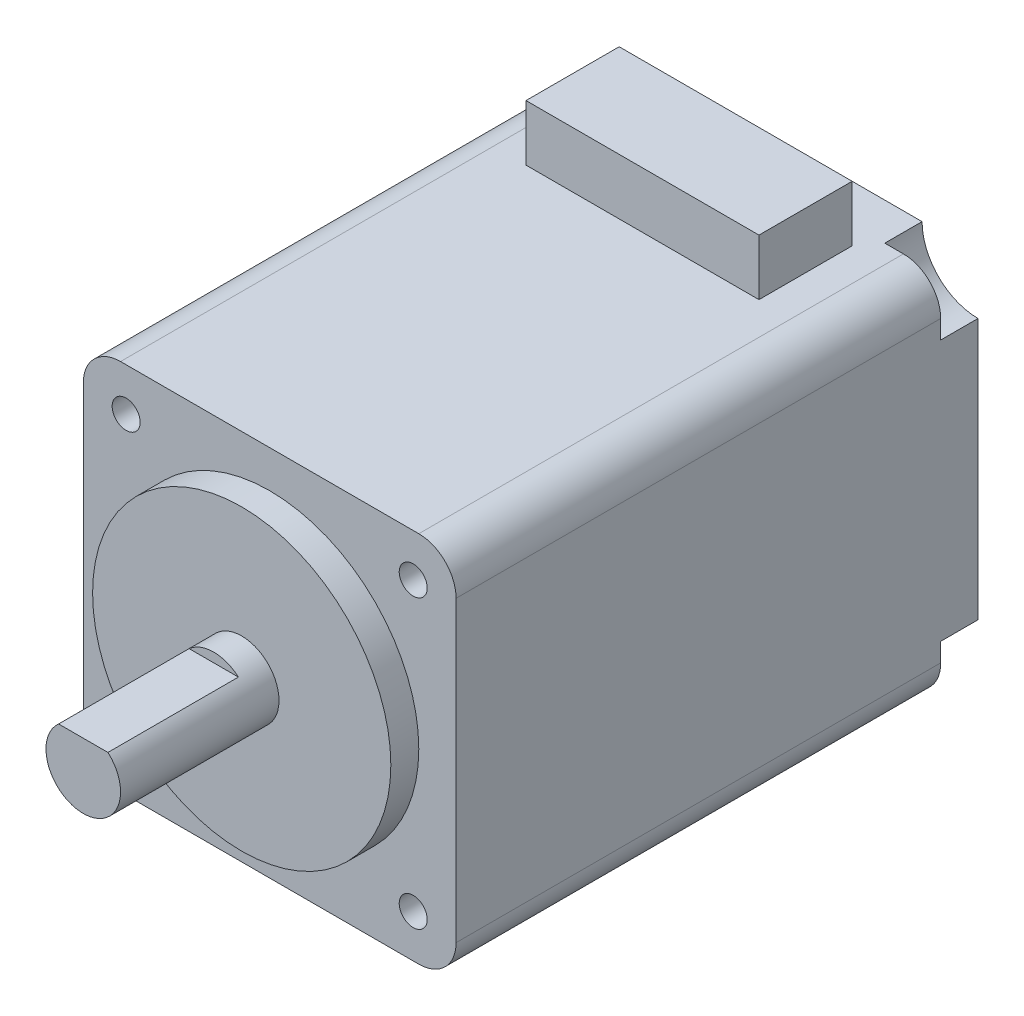
ISO-10303-21;
HEADER;
FILE_DESCRIPTION(('STEP AP214'),'2;1');
FILE_NAME('part.step','',(''),(''),'','','');
FILE_SCHEMA(('AUTOMOTIVE_DESIGN { 1 0 10303 214 1 1 1 1 }'));
ENDSEC;
DATA;
#1=APPLICATION_CONTEXT('core data for automotive mechanical design processes');
#2=APPLICATION_PROTOCOL_DEFINITION('international standard','automotive_design',2000,#1);
#3=PRODUCT_CONTEXT('',#1,'mechanical');
#4=PRODUCT('Part','Part','',(#3));
#5=PRODUCT_RELATED_PRODUCT_CATEGORY('part','',(#4));
#6=PRODUCT_DEFINITION_FORMATION('','',#4);
#7=PRODUCT_DEFINITION_CONTEXT('part definition',#1,'design');
#8=PRODUCT_DEFINITION('design','',#6,#7);
#9=PRODUCT_DEFINITION_SHAPE('','',#8);
#10=(LENGTH_UNIT() NAMED_UNIT(*) SI_UNIT(.MILLI.,.METRE.));
#11=(NAMED_UNIT(*) PLANE_ANGLE_UNIT() SI_UNIT($,.RADIAN.));
#12=(NAMED_UNIT(*) SI_UNIT($,.STERADIAN.) SOLID_ANGLE_UNIT());
#13=UNCERTAINTY_MEASURE_WITH_UNIT(LENGTH_MEASURE(1.E-05),#10,'distance_accuracy_value','');
#14=(GEOMETRIC_REPRESENTATION_CONTEXT(3) GLOBAL_UNCERTAINTY_ASSIGNED_CONTEXT((#13)) GLOBAL_UNIT_ASSIGNED_CONTEXT((#10,
#11,#12)) REPRESENTATION_CONTEXT('',''));
#15=CARTESIAN_POINT('',(0.,0.,0.));
#16=DIRECTION('',(0.,0.,1.));
#17=DIRECTION('',(1.,0.,0.));
#18=AXIS2_PLACEMENT_3D('',#15,#16,#17);
#19=CARTESIAN_POINT('',(-10.,10.,28.));
#20=DIRECTION('',(0.,-1.,0.));
#21=DIRECTION('',(0.,0.,-1.));
#22=AXIS2_PLACEMENT_3D('',#19,#20,#21);
#23=PLANE('',#22);
#24=DIRECTION('',(1.,0.,0.));
#25=VECTOR('',#24,1.);
#26=CARTESIAN_POINT('',(-10.,10.,2.));
#27=LINE('',#26,#25);
#28=CARTESIAN_POINT('',(-8.,10.,2.));
#29=VERTEX_POINT('',#28);
#30=CARTESIAN_POINT('',(-7.,10.,2.));
#31=VERTEX_POINT('',#30);
#32=EDGE_CURVE('E298',#29,#31,#27,.T.);
#33=ORIENTED_EDGE('',*,*,#32,.F.);
#34=DIRECTION('',(0.,0.,-1.));
#35=VECTOR('',#34,1.);
#36=CARTESIAN_POINT('',(-8.,10.,28.));
#37=LINE('',#36,#35);
#38=CARTESIAN_POINT('',(-8.,10.,28.));
#39=VERTEX_POINT('',#38);
#40=EDGE_CURVE('E371',#29,#39,#37,.F.);
#41=ORIENTED_EDGE('',*,*,#40,.T.);
#42=DIRECTION('',(-1.,0.,0.));
#43=VECTOR('',#42,1.);
#44=CARTESIAN_POINT('',(-10.,10.,28.));
#45=LINE('',#44,#43);
#46=CARTESIAN_POINT('',(8.,10.,28.));
#47=VERTEX_POINT('',#46);
#48=EDGE_CURVE('E306',#47,#39,#45,.T.);
#49=ORIENTED_EDGE('',*,*,#48,.F.);
#50=DIRECTION('',(0.,0.,-1.));
#51=VECTOR('',#50,1.);
#52=CARTESIAN_POINT('',(8.,10.,28.));
#53=LINE('',#52,#51);
#54=CARTESIAN_POINT('',(8.,10.,2.));
#55=VERTEX_POINT('',#54);
#56=EDGE_CURVE('E369',#47,#55,#53,.T.);
#57=ORIENTED_EDGE('',*,*,#56,.T.);
#58=DIRECTION('',(1.,0.,0.));
#59=VECTOR('',#58,1.);
#60=CARTESIAN_POINT('',(-10.,10.,2.));
#61=LINE('',#60,#59);
#62=CARTESIAN_POINT('',(7.,10.,2.));
#63=VERTEX_POINT('',#62);
#64=EDGE_CURVE('E337',#63,#55,#61,.T.);
#65=ORIENTED_EDGE('',*,*,#64,.F.);
#66=DIRECTION('',(0.,0.,-1.));
#67=VECTOR('',#66,1.);
#68=CARTESIAN_POINT('',(7.,10.,2.));
#69=LINE('',#68,#67);
#70=CARTESIAN_POINT('',(7.,10.,0.));
#71=VERTEX_POINT('',#70);
#72=EDGE_CURVE('E269',#63,#71,#69,.T.);
#73=ORIENTED_EDGE('',*,*,#72,.T.);
#74=DIRECTION('',(-1.,0.,0.));
#75=VECTOR('',#74,1.);
#76=CARTESIAN_POINT('',(-10.,10.,0.));
#77=LINE('',#76,#75);
#78=CARTESIAN_POINT('',(-7.,10.,0.));
#79=VERTEX_POINT('',#78);
#80=EDGE_CURVE('E319',#71,#79,#77,.T.);
#81=ORIENTED_EDGE('',*,*,#80,.T.);
#82=DIRECTION('',(0.,0.,-1.));
#83=VECTOR('',#82,1.);
#84=CARTESIAN_POINT('',(-7.,10.,2.));
#85=LINE('',#84,#83);
#86=EDGE_CURVE('E278',#79,#31,#85,.F.);
#87=ORIENTED_EDGE('',*,*,#86,.T.);
#88=EDGE_LOOP('',(#33,#41,#49,#57,#65,#73,#81,#87));
#89=FACE_BOUND('',#88,.T.);
#90=DIRECTION('',(0.,0.,-1.));
#91=VECTOR('',#90,1.);
#92=CARTESIAN_POINT('',(6.25,10.,8.));
#93=LINE('',#92,#91);
#94=CARTESIAN_POINT('',(6.25,10.,8.));
#95=VERTEX_POINT('',#94);
#96=CARTESIAN_POINT('',(6.25,10.,3.));
#97=VERTEX_POINT('',#96);
#98=EDGE_CURVE('E204',#95,#97,#93,.T.);
#99=ORIENTED_EDGE('',*,*,#98,.F.);
#100=DIRECTION('',(1.,0.,0.));
#101=VECTOR('',#100,1.);
#102=CARTESIAN_POINT('',(6.25,10.,8.));
#103=LINE('',#102,#101);
#104=CARTESIAN_POINT('',(-6.25,10.,8.00000000000001));
#105=VERTEX_POINT('',#104);
#106=EDGE_CURVE('E217',#105,#95,#103,.T.);
#107=ORIENTED_EDGE('',*,*,#106,.F.);
#108=DIRECTION('',(0.,0.,1.));
#109=VECTOR('',#108,1.);
#110=CARTESIAN_POINT('',(-6.25,10.,8.));
#111=LINE('',#110,#109);
#112=CARTESIAN_POINT('',(-6.25,10.,3.00000000000001));
#113=VERTEX_POINT('',#112);
#114=EDGE_CURVE('E229',#113,#105,#111,.T.);
#115=ORIENTED_EDGE('',*,*,#114,.F.);
#116=DIRECTION('',(-1.,0.,0.));
#117=VECTOR('',#116,1.);
#118=CARTESIAN_POINT('',(6.25,10.,3.));
#119=LINE('',#118,#117);
#120=EDGE_CURVE('E226',#97,#113,#119,.T.);
#121=ORIENTED_EDGE('',*,*,#120,.F.);
#122=EDGE_LOOP('',(#99,#107,#115,#121));
#123=FACE_BOUND('',#122,.T.);
#124=ADVANCED_FACE('F38',(#89,#123),#23,.F.);
#125=CARTESIAN_POINT('',(10.,10.,28.));
#126=DIRECTION('',(-1.,0.,0.));
#127=DIRECTION('',(0.,-1.,0.));
#128=AXIS2_PLACEMENT_3D('',#125,#126,#127);
#129=PLANE('',#128);
#130=DIRECTION('',(0.,1.,0.));
#131=VECTOR('',#130,1.);
#132=CARTESIAN_POINT('',(10.,10.,28.));
#133=LINE('',#132,#131);
#134=CARTESIAN_POINT('',(10.,-8.,28.));
#135=VERTEX_POINT('',#134);
#136=CARTESIAN_POINT('',(10.,8.,28.));
#137=VERTEX_POINT('',#136);
#138=EDGE_CURVE('E303',#135,#137,#133,.T.);
#139=ORIENTED_EDGE('',*,*,#138,.F.);
#140=DIRECTION('',(0.,0.,-1.));
#141=VECTOR('',#140,1.);
#142=CARTESIAN_POINT('',(10.,-8.,28.));
#143=LINE('',#142,#141);
#144=CARTESIAN_POINT('',(10.,-8.,2.));
#145=VERTEX_POINT('',#144);
#146=EDGE_CURVE('E342',#135,#145,#143,.T.);
#147=ORIENTED_EDGE('',*,*,#146,.T.);
#148=DIRECTION('',(0.,-1.,0.));
#149=VECTOR('',#148,1.);
#150=CARTESIAN_POINT('',(10.,10.,2.));
#151=LINE('',#150,#149);
#152=CARTESIAN_POINT('',(10.,-7.,2.));
#153=VERTEX_POINT('',#152);
#154=EDGE_CURVE('E295',#153,#145,#151,.T.);
#155=ORIENTED_EDGE('',*,*,#154,.F.);
#156=DIRECTION('',(0.,0.,-1.));
#157=VECTOR('',#156,1.);
#158=CARTESIAN_POINT('',(10.,-7.,2.));
#159=LINE('',#158,#157);
#160=CARTESIAN_POINT('',(10.,-7.,0.));
#161=VERTEX_POINT('',#160);
#162=EDGE_CURVE('E290',#153,#161,#159,.T.);
#163=ORIENTED_EDGE('',*,*,#162,.T.);
#164=DIRECTION('',(0.,1.,0.));
#165=VECTOR('',#164,1.);
#166=CARTESIAN_POINT('',(10.,10.,0.));
#167=LINE('',#166,#165);
#168=CARTESIAN_POINT('',(10.,7.,0.));
#169=VERTEX_POINT('',#168);
#170=EDGE_CURVE('E302',#161,#169,#167,.T.);
#171=ORIENTED_EDGE('',*,*,#170,.T.);
#172=DIRECTION('',(0.,0.,-1.));
#173=VECTOR('',#172,1.);
#174=CARTESIAN_POINT('',(10.,7.,2.));
#175=LINE('',#174,#173);
#176=CARTESIAN_POINT('',(10.,7.,2.));
#177=VERTEX_POINT('',#176);
#178=EDGE_CURVE('E272',#169,#177,#175,.F.);
#179=ORIENTED_EDGE('',*,*,#178,.T.);
#180=DIRECTION('',(0.,-1.,0.));
#181=VECTOR('',#180,1.);
#182=CARTESIAN_POINT('',(10.,10.,2.));
#183=LINE('',#182,#181);
#184=CARTESIAN_POINT('',(10.,8.,2.));
#185=VERTEX_POINT('',#184);
#186=EDGE_CURVE('E300',#185,#177,#183,.T.);
#187=ORIENTED_EDGE('',*,*,#186,.F.);
#188=DIRECTION('',(0.,0.,-1.));
#189=VECTOR('',#188,1.);
#190=CARTESIAN_POINT('',(10.,8.,28.));
#191=LINE('',#190,#189);
#192=EDGE_CURVE('E340',#185,#137,#191,.F.);
#193=ORIENTED_EDGE('',*,*,#192,.T.);
#194=EDGE_LOOP('',(#139,#147,#155,#163,#171,#179,#187,#193));
#195=FACE_BOUND('',#194,.T.);
#196=ADVANCED_FACE('F380',(#195),#129,.F.);
#197=CARTESIAN_POINT('',(-10.,10.,28.));
#198=DIRECTION('',(1.,0.,0.));
#199=DIRECTION('',(0.,1.,0.));
#200=AXIS2_PLACEMENT_3D('',#197,#198,#199);
#201=PLANE('',#200);
#202=DIRECTION('',(0.,1.,0.));
#203=VECTOR('',#202,1.);
#204=CARTESIAN_POINT('',(-10.,10.,2.));
#205=LINE('',#204,#203);
#206=CARTESIAN_POINT('',(-10.,-8.,2.));
#207=VERTEX_POINT('',#206);
#208=CARTESIAN_POINT('',(-10.,-7.,2.));
#209=VERTEX_POINT('',#208);
#210=EDGE_CURVE('E293',#207,#209,#205,.T.);
#211=ORIENTED_EDGE('',*,*,#210,.F.);
#212=DIRECTION('',(0.,0.,-1.));
#213=VECTOR('',#212,1.);
#214=CARTESIAN_POINT('',(-10.,-8.,28.));
#215=LINE('',#214,#213);
#216=CARTESIAN_POINT('',(-10.,-8.,28.));
#217=VERTEX_POINT('',#216);
#218=EDGE_CURVE('E365',#207,#217,#215,.F.);
#219=ORIENTED_EDGE('',*,*,#218,.T.);
#220=DIRECTION('',(0.,-1.,0.));
#221=VECTOR('',#220,1.);
#222=CARTESIAN_POINT('',(-10.,10.,28.));
#223=LINE('',#222,#221);
#224=CARTESIAN_POINT('',(-10.,8.,28.));
#225=VERTEX_POINT('',#224);
#226=EDGE_CURVE('E310',#225,#217,#223,.T.);
#227=ORIENTED_EDGE('',*,*,#226,.F.);
#228=DIRECTION('',(0.,0.,-1.));
#229=VECTOR('',#228,1.);
#230=CARTESIAN_POINT('',(-10.,8.,28.));
#231=LINE('',#230,#229);
#232=CARTESIAN_POINT('',(-10.,8.,2.));
#233=VERTEX_POINT('',#232);
#234=EDGE_CURVE('E362',#225,#233,#231,.T.);
#235=ORIENTED_EDGE('',*,*,#234,.T.);
#236=DIRECTION('',(0.,1.,0.));
#237=VECTOR('',#236,1.);
#238=CARTESIAN_POINT('',(-10.,10.,2.));
#239=LINE('',#238,#237);
#240=CARTESIAN_POINT('',(-10.,7.,2.));
#241=VERTEX_POINT('',#240);
#242=EDGE_CURVE('E334',#241,#233,#239,.T.);
#243=ORIENTED_EDGE('',*,*,#242,.F.);
#244=DIRECTION('',(0.,0.,-1.));
#245=VECTOR('',#244,1.);
#246=CARTESIAN_POINT('',(-10.,7.,2.));
#247=LINE('',#246,#245);
#248=CARTESIAN_POINT('',(-10.,7.,0.));
#249=VERTEX_POINT('',#248);
#250=EDGE_CURVE('E275',#241,#249,#247,.T.);
#251=ORIENTED_EDGE('',*,*,#250,.T.);
#252=DIRECTION('',(0.,-1.,0.));
#253=VECTOR('',#252,1.);
#254=CARTESIAN_POINT('',(-10.,10.,0.));
#255=LINE('',#254,#253);
#256=CARTESIAN_POINT('',(-10.,-7.,0.));
#257=VERTEX_POINT('',#256);
#258=EDGE_CURVE('E322',#249,#257,#255,.T.);
#259=ORIENTED_EDGE('',*,*,#258,.T.);
#260=DIRECTION('',(0.,0.,-1.));
#261=VECTOR('',#260,1.);
#262=CARTESIAN_POINT('',(-10.,-7.,2.));
#263=LINE('',#262,#261);
#264=EDGE_CURVE('E284',#257,#209,#263,.F.);
#265=ORIENTED_EDGE('',*,*,#264,.T.);
#266=EDGE_LOOP('',(#211,#219,#227,#235,#243,#251,#259,#265));
#267=FACE_BOUND('',#266,.T.);
#268=ADVANCED_FACE('F397',(#267),#201,.F.);
#269=CARTESIAN_POINT('',(-10.,-10.,28.));
#270=DIRECTION('',(0.,1.,0.));
#271=DIRECTION('',(0.,0.,1.));
#272=AXIS2_PLACEMENT_3D('',#269,#270,#271);
#273=PLANE('',#272);
#274=DIRECTION('',(-1.,0.,0.));
#275=VECTOR('',#274,1.);
#276=CARTESIAN_POINT('',(-10.,-10.,2.));
#277=LINE('',#276,#275);
#278=CARTESIAN_POINT('',(8.,-10.,2.));
#279=VERTEX_POINT('',#278);
#280=CARTESIAN_POINT('',(7.,-10.,2.));
#281=VERTEX_POINT('',#280);
#282=EDGE_CURVE('E332',#279,#281,#277,.T.);
#283=ORIENTED_EDGE('',*,*,#282,.F.);
#284=DIRECTION('',(0.,0.,-1.));
#285=VECTOR('',#284,1.);
#286=CARTESIAN_POINT('',(8.,-10.,28.));
#287=LINE('',#286,#285);
#288=CARTESIAN_POINT('',(8.,-10.,28.));
#289=VERTEX_POINT('',#288);
#290=EDGE_CURVE('E350',#279,#289,#287,.F.);
#291=ORIENTED_EDGE('',*,*,#290,.T.);
#292=DIRECTION('',(1.,0.,0.));
#293=VECTOR('',#292,1.);
#294=CARTESIAN_POINT('',(-10.,-10.,28.));
#295=LINE('',#294,#293);
#296=CARTESIAN_POINT('',(-8.,-10.,28.));
#297=VERTEX_POINT('',#296);
#298=EDGE_CURVE('E313',#297,#289,#295,.T.);
#299=ORIENTED_EDGE('',*,*,#298,.F.);
#300=DIRECTION('',(0.,0.,-1.));
#301=VECTOR('',#300,1.);
#302=CARTESIAN_POINT('',(-8.,-10.,28.));
#303=LINE('',#302,#301);
#304=CARTESIAN_POINT('',(-8.,-10.,2.));
#305=VERTEX_POINT('',#304);
#306=EDGE_CURVE('E347',#297,#305,#303,.T.);
#307=ORIENTED_EDGE('',*,*,#306,.T.);
#308=DIRECTION('',(-1.,0.,0.));
#309=VECTOR('',#308,1.);
#310=CARTESIAN_POINT('',(-10.,-10.,2.));
#311=LINE('',#310,#309);
#312=CARTESIAN_POINT('',(-7.,-10.,2.));
#313=VERTEX_POINT('',#312);
#314=EDGE_CURVE('E329',#313,#305,#311,.T.);
#315=ORIENTED_EDGE('',*,*,#314,.F.);
#316=DIRECTION('',(0.,0.,-1.));
#317=VECTOR('',#316,1.);
#318=CARTESIAN_POINT('',(-7.,-10.,2.));
#319=LINE('',#318,#317);
#320=CARTESIAN_POINT('',(-7.,-10.,0.));
#321=VERTEX_POINT('',#320);
#322=EDGE_CURVE('E281',#313,#321,#319,.T.);
#323=ORIENTED_EDGE('',*,*,#322,.T.);
#324=DIRECTION('',(1.,0.,0.));
#325=VECTOR('',#324,1.);
#326=CARTESIAN_POINT('',(-10.,-10.,0.));
#327=LINE('',#326,#325);
#328=CARTESIAN_POINT('',(7.,-10.,0.));
#329=VERTEX_POINT('',#328);
#330=EDGE_CURVE('E307',#321,#329,#327,.T.);
#331=ORIENTED_EDGE('',*,*,#330,.T.);
#332=DIRECTION('',(0.,0.,-1.));
#333=VECTOR('',#332,1.);
#334=CARTESIAN_POINT('',(7.,-10.,2.));
#335=LINE('',#334,#333);
#336=EDGE_CURVE('E287',#329,#281,#335,.F.);
#337=ORIENTED_EDGE('',*,*,#336,.T.);
#338=EDGE_LOOP('',(#283,#291,#299,#307,#315,#323,#331,#337));
#339=FACE_BOUND('',#338,.T.);
#340=ADVANCED_FACE('F407',(#339),#273,.F.);
#341=CARTESIAN_POINT('',(0.,0.,28.));
#342=DIRECTION('',(0.,0.,1.));
#343=DIRECTION('',(1.,0.,0.));
#344=AXIS2_PLACEMENT_3D('',#341,#342,#343);
#345=PLANE('',#344);
#346=CARTESIAN_POINT('',(-7.7,-7.7,28.));
#347=DIRECTION('',(0.,0.,1.));
#348=DIRECTION('',(1.,0.,0.));
#349=AXIS2_PLACEMENT_3D('',#346,#347,#348);
#350=CIRCLE('',#349,0.749999999999999);
#351=CARTESIAN_POINT('',(-6.95,-7.7,28.));
#352=VERTEX_POINT('',#351);
#353=EDGE_CURVE('E825',#352,#352,#350,.T.);
#354=ORIENTED_EDGE('',*,*,#353,.F.);
#355=EDGE_LOOP('',(#354));
#356=FACE_BOUND('',#355,.T.);
#357=CARTESIAN_POINT('',(7.7,-7.7,28.));
#358=DIRECTION('',(0.,0.,1.));
#359=DIRECTION('',(1.,0.,0.));
#360=AXIS2_PLACEMENT_3D('',#357,#358,#359);
#361=CIRCLE('',#360,0.75);
#362=CARTESIAN_POINT('',(8.45,-7.7,28.));
#363=VERTEX_POINT('',#362);
#364=EDGE_CURVE('E824',#363,#363,#361,.T.);
#365=ORIENTED_EDGE('',*,*,#364,.F.);
#366=EDGE_LOOP('',(#365));
#367=FACE_BOUND('',#366,.T.);
#368=CARTESIAN_POINT('',(7.7,7.7,28.));
#369=DIRECTION('',(0.,0.,1.));
#370=DIRECTION('',(1.,0.,0.));
#371=AXIS2_PLACEMENT_3D('',#368,#369,#370);
#372=CIRCLE('',#371,0.75);
#373=CARTESIAN_POINT('',(8.45,7.7,28.));
#374=VERTEX_POINT('',#373);
#375=EDGE_CURVE('E844',#374,#374,#372,.T.);
#376=ORIENTED_EDGE('',*,*,#375,.F.);
#377=EDGE_LOOP('',(#376));
#378=FACE_BOUND('',#377,.T.);
#379=CARTESIAN_POINT('',(-7.7,7.7,28.));
#380=DIRECTION('',(0.,0.,1.));
#381=DIRECTION('',(1.,0.,0.));
#382=AXIS2_PLACEMENT_3D('',#379,#380,#381);
#383=CIRCLE('',#382,0.75);
#384=CARTESIAN_POINT('',(-6.95,7.7,28.));
#385=VERTEX_POINT('',#384);
#386=EDGE_CURVE('E837',#385,#385,#383,.T.);
#387=ORIENTED_EDGE('',*,*,#386,.F.);
#388=EDGE_LOOP('',(#387));
#389=FACE_BOUND('',#388,.T.);
#390=CARTESIAN_POINT('',(0.,0.,28.));
#391=DIRECTION('',(0.,0.,1.));
#392=DIRECTION('',(1.,0.,0.));
#393=AXIS2_PLACEMENT_3D('',#390,#391,#392);
#394=CIRCLE('',#393,8.);
#395=CARTESIAN_POINT('',(8.,0.,28.));
#396=VERTEX_POINT('',#395);
#397=EDGE_CURVE('E209',#396,#396,#394,.T.);
#398=ORIENTED_EDGE('',*,*,#397,.F.);
#399=EDGE_LOOP('',(#398));
#400=FACE_BOUND('',#399,.T.);
#401=ORIENTED_EDGE('',*,*,#298,.T.);
#402=CARTESIAN_POINT('',(8.,-8.,28.));
#403=DIRECTION('',(0.,0.,1.));
#404=DIRECTION('',(1.,0.,0.));
#405=AXIS2_PLACEMENT_3D('',#402,#403,#404);
#406=CIRCLE('',#405,2.);
#407=EDGE_CURVE('E358',#289,#135,#406,.T.);
#408=ORIENTED_EDGE('',*,*,#407,.T.);
#409=ORIENTED_EDGE('',*,*,#138,.T.);
#410=CARTESIAN_POINT('',(8.,8.,28.));
#411=DIRECTION('',(0.,0.,1.));
#412=DIRECTION('',(1.,0.,0.));
#413=AXIS2_PLACEMENT_3D('',#410,#411,#412);
#414=CIRCLE('',#413,2.);
#415=EDGE_CURVE('E352',#137,#47,#414,.T.);
#416=ORIENTED_EDGE('',*,*,#415,.T.);
#417=ORIENTED_EDGE('',*,*,#48,.T.);
#418=CARTESIAN_POINT('',(-8.,8.,28.));
#419=DIRECTION('',(0.,0.,1.));
#420=DIRECTION('',(1.,0.,0.));
#421=AXIS2_PLACEMENT_3D('',#418,#419,#420);
#422=CIRCLE('',#421,2.);
#423=EDGE_CURVE('E354',#39,#225,#422,.T.);
#424=ORIENTED_EDGE('',*,*,#423,.T.);
#425=ORIENTED_EDGE('',*,*,#226,.T.);
#426=CARTESIAN_POINT('',(-8.,-8.,28.));
#427=DIRECTION('',(0.,0.,1.));
#428=DIRECTION('',(1.,0.,0.));
#429=AXIS2_PLACEMENT_3D('',#426,#427,#428);
#430=CIRCLE('',#429,2.);
#431=EDGE_CURVE('E356',#217,#297,#430,.T.);
#432=ORIENTED_EDGE('',*,*,#431,.T.);
#433=EDGE_LOOP('',(#401,#408,#409,#416,#417,#424,#425,#432));
#434=FACE_BOUND('',#433,.T.);
#435=ADVANCED_FACE('F384',(#356,#367,#378,#389,#400,#434),#345,.T.);
#436=CARTESIAN_POINT('',(0.,0.,0.));
#437=DIRECTION('',(0.,0.,1.));
#438=DIRECTION('',(1.,0.,0.));
#439=AXIS2_PLACEMENT_3D('',#436,#437,#438);
#440=PLANE('',#439);
#441=CARTESIAN_POINT('',(0.,0.,0.));
#442=DIRECTION('',(0.,0.,-1.));
#443=DIRECTION('',(-1.,0.,0.));
#444=AXIS2_PLACEMENT_3D('',#441,#442,#443);
#445=CIRCLE('',#444,3.25);
#446=CARTESIAN_POINT('',(-3.25,0.,0.));
#447=VERTEX_POINT('',#446);
#448=EDGE_CURVE('E246',#447,#447,#445,.T.);
#449=ORIENTED_EDGE('',*,*,#448,.F.);
#450=EDGE_LOOP('',(#449));
#451=FACE_BOUND('',#450,.T.);
#452=ORIENTED_EDGE('',*,*,#170,.F.);
#453=CARTESIAN_POINT('',(10.,-10.,0.));
#454=DIRECTION('',(0.,0.,-1.));
#455=DIRECTION('',(-1.,0.,0.));
#456=AXIS2_PLACEMENT_3D('',#453,#454,#455);
#457=CIRCLE('',#456,3.);
#458=EDGE_CURVE('E263',#329,#161,#457,.T.);
#459=ORIENTED_EDGE('',*,*,#458,.F.);
#460=ORIENTED_EDGE('',*,*,#330,.F.);
#461=CARTESIAN_POINT('',(-10.,-10.,0.));
#462=DIRECTION('',(0.,0.,-1.));
#463=DIRECTION('',(-1.,0.,0.));
#464=AXIS2_PLACEMENT_3D('',#461,#462,#463);
#465=CIRCLE('',#464,3.);
#466=EDGE_CURVE('E258',#257,#321,#465,.T.);
#467=ORIENTED_EDGE('',*,*,#466,.F.);
#468=ORIENTED_EDGE('',*,*,#258,.F.);
#469=CARTESIAN_POINT('',(-10.,10.,0.));
#470=DIRECTION('',(0.,0.,-1.));
#471=DIRECTION('',(-1.,0.,0.));
#472=AXIS2_PLACEMENT_3D('',#469,#470,#471);
#473=CIRCLE('',#472,3.);
#474=EDGE_CURVE('E253',#79,#249,#473,.T.);
#475=ORIENTED_EDGE('',*,*,#474,.F.);
#476=ORIENTED_EDGE('',*,*,#80,.F.);
#477=CARTESIAN_POINT('',(10.,10.,0.));
#478=DIRECTION('',(0.,0.,1.));
#479=DIRECTION('',(1.,0.,0.));
#480=AXIS2_PLACEMENT_3D('',#477,#478,#479);
#481=CIRCLE('',#480,3.);
#482=EDGE_CURVE('E316',#71,#169,#481,.T.);
#483=ORIENTED_EDGE('',*,*,#482,.T.);
#484=EDGE_LOOP('',(#452,#459,#460,#467,#468,#475,#476,#483));
#485=FACE_BOUND('',#484,.T.);
#486=ADVANCED_FACE('F424',(#451,#485),#440,.F.);
#487=CARTESIAN_POINT('',(10.,10.,2.));
#488=DIRECTION('',(0.,0.,-1.));
#489=DIRECTION('',(-1.,0.,0.));
#490=AXIS2_PLACEMENT_3D('',#487,#488,#489);
#491=PLANE('',#490);
#492=ORIENTED_EDGE('',*,*,#64,.T.);
#493=CARTESIAN_POINT('',(8.,8.,2.));
#494=DIRECTION('',(0.,0.,-1.));
#495=DIRECTION('',(-1.,0.,0.));
#496=AXIS2_PLACEMENT_3D('',#493,#494,#495);
#497=CIRCLE('',#496,2.);
#498=EDGE_CURVE('E61',#55,#185,#497,.T.);
#499=ORIENTED_EDGE('',*,*,#498,.T.);
#500=ORIENTED_EDGE('',*,*,#186,.T.);
#501=CARTESIAN_POINT('',(10.,10.,2.));
#502=DIRECTION('',(0.,0.,-1.));
#503=DIRECTION('',(-1.,0.,0.));
#504=AXIS2_PLACEMENT_3D('',#501,#502,#503);
#505=CIRCLE('',#504,3.);
#506=EDGE_CURVE('E249',#177,#63,#505,.T.);
#507=ORIENTED_EDGE('',*,*,#506,.T.);
#508=EDGE_LOOP('',(#492,#499,#500,#507));
#509=FACE_BOUND('',#508,.T.);
#510=ADVANCED_FACE('F375',(#509),#491,.T.);
#511=CARTESIAN_POINT('',(10.,10.,2.));
#512=DIRECTION('',(0.,0.,-1.));
#513=DIRECTION('',(-1.,0.,0.));
#514=AXIS2_PLACEMENT_3D('',#511,#512,#513);
#515=CYLINDRICAL_SURFACE('',#514,3.);
#516=ORIENTED_EDGE('',*,*,#482,.F.);
#517=ORIENTED_EDGE('',*,*,#72,.F.);
#518=ORIENTED_EDGE('',*,*,#506,.F.);
#519=ORIENTED_EDGE('',*,*,#178,.F.);
#520=EDGE_LOOP('',(#516,#517,#518,#519));
#521=FACE_BOUND('',#520,.T.);
#522=ADVANCED_FACE('F429',(#521),#515,.F.);
#523=CARTESIAN_POINT('',(0.,0.,2.));
#524=DIRECTION('',(0.,0.,-1.));
#525=DIRECTION('',(-1.,0.,0.));
#526=AXIS2_PLACEMENT_3D('',#523,#524,#525);
#527=CYLINDRICAL_SURFACE('',#526,3.25);
#528=CARTESIAN_POINT('',(0.,0.,2.));
#529=DIRECTION('',(0.,0.,-1.));
#530=DIRECTION('',(-1.,0.,0.));
#531=AXIS2_PLACEMENT_3D('',#528,#529,#530);
#532=CIRCLE('',#531,3.25);
#533=CARTESIAN_POINT('',(-3.25,0.,2.));
#534=VERTEX_POINT('',#533);
#535=EDGE_CURVE('E250',#534,#534,#532,.T.);
#536=ORIENTED_EDGE('',*,*,#535,.F.);
#537=EDGE_LOOP('',(#536));
#538=FACE_BOUND('',#537,.T.);
#539=ORIENTED_EDGE('',*,*,#448,.T.);
#540=EDGE_LOOP('',(#539));
#541=FACE_BOUND('',#540,.T.);
#542=ADVANCED_FACE('F444',(#538,#541),#527,.F.);
#543=CARTESIAN_POINT('',(0.,0.,2.));
#544=DIRECTION('',(0.,0.,-1.));
#545=DIRECTION('',(-1.,0.,0.));
#546=AXIS2_PLACEMENT_3D('',#543,#544,#545);
#547=PLANE('',#546);
#548=ORIENTED_EDGE('',*,*,#535,.T.);
#549=EDGE_LOOP('',(#548));
#550=FACE_BOUND('',#549,.T.);
#551=ADVANCED_FACE('F436',(#550),#547,.T.);
#552=CARTESIAN_POINT('',(-10.,10.,2.));
#553=DIRECTION('',(0.,0.,-1.));
#554=DIRECTION('',(-1.,0.,0.));
#555=AXIS2_PLACEMENT_3D('',#552,#553,#554);
#556=PLANE('',#555);
#557=ORIENTED_EDGE('',*,*,#242,.T.);
#558=CARTESIAN_POINT('',(-8.,8.,2.));
#559=DIRECTION('',(0.,0.,-1.));
#560=DIRECTION('',(-1.,0.,0.));
#561=AXIS2_PLACEMENT_3D('',#558,#559,#560);
#562=CIRCLE('',#561,2.);
#563=EDGE_CURVE('E367',#233,#29,#562,.T.);
#564=ORIENTED_EDGE('',*,*,#563,.T.);
#565=ORIENTED_EDGE('',*,*,#32,.T.);
#566=CARTESIAN_POINT('',(-10.,10.,2.));
#567=DIRECTION('',(0.,0.,-1.));
#568=DIRECTION('',(-1.,0.,0.));
#569=AXIS2_PLACEMENT_3D('',#566,#567,#568);
#570=CIRCLE('',#569,3.);
#571=EDGE_CURVE('E255',#31,#241,#570,.T.);
#572=ORIENTED_EDGE('',*,*,#571,.T.);
#573=EDGE_LOOP('',(#557,#564,#565,#572));
#574=FACE_BOUND('',#573,.T.);
#575=ADVANCED_FACE('F434',(#574),#556,.T.);
#576=CARTESIAN_POINT('',(-10.,10.,2.));
#577=DIRECTION('',(0.,0.,-1.));
#578=DIRECTION('',(-1.,0.,0.));
#579=AXIS2_PLACEMENT_3D('',#576,#577,#578);
#580=CYLINDRICAL_SURFACE('',#579,3.);
#581=ORIENTED_EDGE('',*,*,#474,.T.);
#582=ORIENTED_EDGE('',*,*,#250,.F.);
#583=ORIENTED_EDGE('',*,*,#571,.F.);
#584=ORIENTED_EDGE('',*,*,#86,.F.);
#585=EDGE_LOOP('',(#581,#582,#583,#584));
#586=FACE_BOUND('',#585,.T.);
#587=ADVANCED_FACE('F432',(#586),#580,.F.);
#588=CARTESIAN_POINT('',(-10.,-10.,2.));
#589=DIRECTION('',(0.,0.,-1.));
#590=DIRECTION('',(-1.,0.,0.));
#591=AXIS2_PLACEMENT_3D('',#588,#589,#590);
#592=PLANE('',#591);
#593=ORIENTED_EDGE('',*,*,#314,.T.);
#594=CARTESIAN_POINT('',(-8.,-8.,2.));
#595=DIRECTION('',(0.,0.,-1.));
#596=DIRECTION('',(-1.,0.,0.));
#597=AXIS2_PLACEMENT_3D('',#594,#595,#596);
#598=CIRCLE('',#597,2.);
#599=EDGE_CURVE('E360',#305,#207,#598,.T.);
#600=ORIENTED_EDGE('',*,*,#599,.T.);
#601=ORIENTED_EDGE('',*,*,#210,.T.);
#602=CARTESIAN_POINT('',(-10.,-10.,2.));
#603=DIRECTION('',(0.,0.,-1.));
#604=DIRECTION('',(-1.,0.,0.));
#605=AXIS2_PLACEMENT_3D('',#602,#603,#604);
#606=CIRCLE('',#605,3.);
#607=EDGE_CURVE('E260',#209,#313,#606,.T.);
#608=ORIENTED_EDGE('',*,*,#607,.T.);
#609=EDGE_LOOP('',(#593,#600,#601,#608));
#610=FACE_BOUND('',#609,.T.);
#611=ADVANCED_FACE('F442',(#610),#592,.T.);
#612=CARTESIAN_POINT('',(-10.,-10.,2.));
#613=DIRECTION('',(0.,0.,-1.));
#614=DIRECTION('',(-1.,0.,0.));
#615=AXIS2_PLACEMENT_3D('',#612,#613,#614);
#616=CYLINDRICAL_SURFACE('',#615,3.);
#617=ORIENTED_EDGE('',*,*,#466,.T.);
#618=ORIENTED_EDGE('',*,*,#322,.F.);
#619=ORIENTED_EDGE('',*,*,#607,.F.);
#620=ORIENTED_EDGE('',*,*,#264,.F.);
#621=EDGE_LOOP('',(#617,#618,#619,#620));
#622=FACE_BOUND('',#621,.T.);
#623=ADVANCED_FACE('F585',(#622),#616,.F.);
#624=CARTESIAN_POINT('',(10.,-10.,2.));
#625=DIRECTION('',(0.,0.,-1.));
#626=DIRECTION('',(-1.,0.,0.));
#627=AXIS2_PLACEMENT_3D('',#624,#625,#626);
#628=PLANE('',#627);
#629=ORIENTED_EDGE('',*,*,#154,.T.);
#630=CARTESIAN_POINT('',(8.,-8.,2.));
#631=DIRECTION('',(0.,0.,-1.));
#632=DIRECTION('',(-1.,0.,0.));
#633=AXIS2_PLACEMENT_3D('',#630,#631,#632);
#634=CIRCLE('',#633,2.);
#635=EDGE_CURVE('E345',#145,#279,#634,.T.);
#636=ORIENTED_EDGE('',*,*,#635,.T.);
#637=ORIENTED_EDGE('',*,*,#282,.T.);
#638=CARTESIAN_POINT('',(10.,-10.,2.));
#639=DIRECTION('',(0.,0.,-1.));
#640=DIRECTION('',(-1.,0.,0.));
#641=AXIS2_PLACEMENT_3D('',#638,#639,#640);
#642=CIRCLE('',#641,3.);
#643=EDGE_CURVE('E245',#281,#153,#642,.T.);
#644=ORIENTED_EDGE('',*,*,#643,.T.);
#645=EDGE_LOOP('',(#629,#636,#637,#644));
#646=FACE_BOUND('',#645,.T.);
#647=ADVANCED_FACE('F415',(#646),#628,.T.);
#648=CARTESIAN_POINT('',(10.,-10.,2.));
#649=DIRECTION('',(0.,0.,-1.));
#650=DIRECTION('',(-1.,0.,0.));
#651=AXIS2_PLACEMENT_3D('',#648,#649,#650);
#652=CYLINDRICAL_SURFACE('',#651,3.);
#653=ORIENTED_EDGE('',*,*,#643,.F.);
#654=ORIENTED_EDGE('',*,*,#336,.F.);
#655=ORIENTED_EDGE('',*,*,#458,.T.);
#656=ORIENTED_EDGE('',*,*,#162,.F.);
#657=EDGE_LOOP('',(#653,#654,#655,#656));
#658=FACE_BOUND('',#657,.T.);
#659=ADVANCED_FACE('F418',(#658),#652,.F.);
#660=CARTESIAN_POINT('',(6.25,13.,8.));
#661=DIRECTION('',(-1.,0.,0.));
#662=DIRECTION('',(0.,0.,1.));
#663=AXIS2_PLACEMENT_3D('',#660,#661,#662);
#664=PLANE('',#663);
#665=ORIENTED_EDGE('',*,*,#98,.T.);
#666=DIRECTION('',(0.,-1.,0.));
#667=VECTOR('',#666,1.);
#668=CARTESIAN_POINT('',(6.25,13.,3.));
#669=LINE('',#668,#667);
#670=CARTESIAN_POINT('',(6.25,13.,3.));
#671=VERTEX_POINT('',#670);
#672=EDGE_CURVE('E242',#671,#97,#669,.T.);
#673=ORIENTED_EDGE('',*,*,#672,.F.);
#674=DIRECTION('',(0.,0.,-1.));
#675=VECTOR('',#674,1.);
#676=CARTESIAN_POINT('',(6.25,13.,8.));
#677=LINE('',#676,#675);
#678=CARTESIAN_POINT('',(6.25,13.,8.));
#679=VERTEX_POINT('',#678);
#680=EDGE_CURVE('E213',#679,#671,#677,.T.);
#681=ORIENTED_EDGE('',*,*,#680,.F.);
#682=DIRECTION('',(0.,-1.,0.));
#683=VECTOR('',#682,1.);
#684=CARTESIAN_POINT('',(6.25,13.,8.));
#685=LINE('',#684,#683);
#686=EDGE_CURVE('E223',#679,#95,#685,.T.);
#687=ORIENTED_EDGE('',*,*,#686,.T.);
#688=EDGE_LOOP('',(#665,#673,#681,#687));
#689=FACE_BOUND('',#688,.T.);
#690=ADVANCED_FACE('F495',(#689),#664,.F.);
#691=CARTESIAN_POINT('',(6.25,13.,3.));
#692=DIRECTION('',(0.,0.,1.));
#693=DIRECTION('',(1.,0.,0.));
#694=AXIS2_PLACEMENT_3D('',#691,#692,#693);
#695=PLANE('',#694);
#696=ORIENTED_EDGE('',*,*,#120,.T.);
#697=DIRECTION('',(0.,-1.,0.));
#698=VECTOR('',#697,1.);
#699=CARTESIAN_POINT('',(-6.25,13.,3.));
#700=LINE('',#699,#698);
#701=CARTESIAN_POINT('',(-6.25,13.,3.));
#702=VERTEX_POINT('',#701);
#703=EDGE_CURVE('E239',#702,#113,#700,.T.);
#704=ORIENTED_EDGE('',*,*,#703,.F.);
#705=DIRECTION('',(-1.,0.,0.));
#706=VECTOR('',#705,1.);
#707=CARTESIAN_POINT('',(6.25,13.,3.));
#708=LINE('',#707,#706);
#709=EDGE_CURVE('E216',#671,#702,#708,.T.);
#710=ORIENTED_EDGE('',*,*,#709,.F.);
#711=ORIENTED_EDGE('',*,*,#672,.T.);
#712=EDGE_LOOP('',(#696,#704,#710,#711));
#713=FACE_BOUND('',#712,.T.);
#714=ADVANCED_FACE('F491',(#713),#695,.F.);
#715=CARTESIAN_POINT('',(-6.25,13.,8.));
#716=DIRECTION('',(1.,0.,0.));
#717=DIRECTION('',(0.,0.,-1.));
#718=AXIS2_PLACEMENT_3D('',#715,#716,#717);
#719=PLANE('',#718);
#720=ORIENTED_EDGE('',*,*,#114,.T.);
#721=DIRECTION('',(0.,-1.,0.));
#722=VECTOR('',#721,1.);
#723=CARTESIAN_POINT('',(-6.25,13.,8.));
#724=LINE('',#723,#722);
#725=CARTESIAN_POINT('',(-6.25,13.,8.));
#726=VERTEX_POINT('',#725);
#727=EDGE_CURVE('E236',#726,#105,#724,.T.);
#728=ORIENTED_EDGE('',*,*,#727,.F.);
#729=DIRECTION('',(0.,0.,1.));
#730=VECTOR('',#729,1.);
#731=CARTESIAN_POINT('',(-6.25,13.,8.));
#732=LINE('',#731,#730);
#733=EDGE_CURVE('E219',#702,#726,#732,.T.);
#734=ORIENTED_EDGE('',*,*,#733,.F.);
#735=ORIENTED_EDGE('',*,*,#703,.T.);
#736=EDGE_LOOP('',(#720,#728,#734,#735));
#737=FACE_BOUND('',#736,.T.);
#738=ADVANCED_FACE('F487',(#737),#719,.F.);
#739=CARTESIAN_POINT('',(6.25,13.,8.));
#740=DIRECTION('',(0.,0.,-1.));
#741=DIRECTION('',(-1.,0.,0.));
#742=AXIS2_PLACEMENT_3D('',#739,#740,#741);
#743=PLANE('',#742);
#744=ORIENTED_EDGE('',*,*,#106,.T.);
#745=ORIENTED_EDGE('',*,*,#686,.F.);
#746=DIRECTION('',(1.,0.,0.));
#747=VECTOR('',#746,1.);
#748=CARTESIAN_POINT('',(6.25,13.,8.));
#749=LINE('',#748,#747);
#750=EDGE_CURVE('E221',#726,#679,#749,.T.);
#751=ORIENTED_EDGE('',*,*,#750,.F.);
#752=ORIENTED_EDGE('',*,*,#727,.T.);
#753=EDGE_LOOP('',(#744,#745,#751,#752));
#754=FACE_BOUND('',#753,.T.);
#755=ADVANCED_FACE('F483',(#754),#743,.F.);
#756=CARTESIAN_POINT('',(0.,13.,0.));
#757=DIRECTION('',(0.,1.,0.));
#758=DIRECTION('',(0.,0.,1.));
#759=AXIS2_PLACEMENT_3D('',#756,#757,#758);
#760=PLANE('',#759);
#761=ORIENTED_EDGE('',*,*,#680,.T.);
#762=ORIENTED_EDGE('',*,*,#709,.T.);
#763=ORIENTED_EDGE('',*,*,#733,.T.);
#764=ORIENTED_EDGE('',*,*,#750,.T.);
#765=EDGE_LOOP('',(#761,#762,#763,#764));
#766=FACE_BOUND('',#765,.T.);
#767=ADVANCED_FACE('F459',(#766),#760,.T.);
#768=CARTESIAN_POINT('',(8.,-8.,28.));
#769=DIRECTION('',(0.,0.,-1.));
#770=DIRECTION('',(-1.,0.,0.));
#771=AXIS2_PLACEMENT_3D('',#768,#769,#770);
#772=CYLINDRICAL_SURFACE('',#771,2.);
#773=ORIENTED_EDGE('',*,*,#407,.F.);
#774=ORIENTED_EDGE('',*,*,#290,.F.);
#775=ORIENTED_EDGE('',*,*,#635,.F.);
#776=ORIENTED_EDGE('',*,*,#146,.F.);
#777=EDGE_LOOP('',(#773,#774,#775,#776));
#778=FACE_BOUND('',#777,.T.);
#779=ADVANCED_FACE('F411',(#778),#772,.T.);
#780=CARTESIAN_POINT('',(-8.,-8.,28.));
#781=DIRECTION('',(0.,0.,-1.));
#782=DIRECTION('',(-1.,0.,0.));
#783=AXIS2_PLACEMENT_3D('',#780,#781,#782);
#784=CYLINDRICAL_SURFACE('',#783,2.);
#785=ORIENTED_EDGE('',*,*,#431,.F.);
#786=ORIENTED_EDGE('',*,*,#218,.F.);
#787=ORIENTED_EDGE('',*,*,#599,.F.);
#788=ORIENTED_EDGE('',*,*,#306,.F.);
#789=EDGE_LOOP('',(#785,#786,#787,#788));
#790=FACE_BOUND('',#789,.T.);
#791=ADVANCED_FACE('F401',(#790),#784,.T.);
#792=CARTESIAN_POINT('',(-8.,8.,28.));
#793=DIRECTION('',(0.,0.,-1.));
#794=DIRECTION('',(-1.,0.,0.));
#795=AXIS2_PLACEMENT_3D('',#792,#793,#794);
#796=CYLINDRICAL_SURFACE('',#795,2.);
#797=ORIENTED_EDGE('',*,*,#423,.F.);
#798=ORIENTED_EDGE('',*,*,#40,.F.);
#799=ORIENTED_EDGE('',*,*,#563,.F.);
#800=ORIENTED_EDGE('',*,*,#234,.F.);
#801=EDGE_LOOP('',(#797,#798,#799,#800));
#802=FACE_BOUND('',#801,.T.);
#803=ADVANCED_FACE('F391',(#802),#796,.T.);
#804=CARTESIAN_POINT('',(8.,8.,28.));
#805=DIRECTION('',(0.,0.,-1.));
#806=DIRECTION('',(-1.,0.,0.));
#807=AXIS2_PLACEMENT_3D('',#804,#805,#806);
#808=CYLINDRICAL_SURFACE('',#807,2.);
#809=ORIENTED_EDGE('',*,*,#415,.F.);
#810=ORIENTED_EDGE('',*,*,#192,.F.);
#811=ORIENTED_EDGE('',*,*,#498,.F.);
#812=ORIENTED_EDGE('',*,*,#56,.F.);
#813=EDGE_LOOP('',(#809,#810,#811,#812));
#814=FACE_BOUND('',#813,.T.);
#815=ADVANCED_FACE('F40',(#814),#808,.T.);
#816=CARTESIAN_POINT('',(0.,0.,29.5));
#817=DIRECTION('',(0.,0.,-1.));
#818=DIRECTION('',(-1.,0.,0.));
#819=AXIS2_PLACEMENT_3D('',#816,#817,#818);
#820=CYLINDRICAL_SURFACE('',#819,8.);
#821=CARTESIAN_POINT('',(0.,0.,29.5));
#822=DIRECTION('',(0.,0.,1.));
#823=DIRECTION('',(1.,0.,0.));
#824=AXIS2_PLACEMENT_3D('',#821,#822,#823);
#825=CIRCLE('',#824,8.);
#826=CARTESIAN_POINT('',(8.,0.,29.5));
#827=VERTEX_POINT('',#826);
#828=EDGE_CURVE('E201',#827,#827,#825,.T.);
#829=ORIENTED_EDGE('',*,*,#828,.F.);
#830=EDGE_LOOP('',(#829));
#831=FACE_BOUND('',#830,.T.);
#832=ORIENTED_EDGE('',*,*,#397,.T.);
#833=EDGE_LOOP('',(#832));
#834=FACE_BOUND('',#833,.T.);
#835=ADVANCED_FACE('F465',(#831,#834),#820,.T.);
#836=CARTESIAN_POINT('',(0.,0.,29.5));
#837=DIRECTION('',(0.,0.,1.));
#838=DIRECTION('',(1.,0.,0.));
#839=AXIS2_PLACEMENT_3D('',#836,#837,#838);
#840=PLANE('',#839);
#841=CARTESIAN_POINT('',(0.,0.,29.5));
#842=DIRECTION('',(0.,0.,1.));
#843=DIRECTION('',(1.,0.,0.));
#844=AXIS2_PLACEMENT_3D('',#841,#842,#843);
#845=CIRCLE('',#844,2.);
#846=CARTESIAN_POINT('',(2.,0.,29.5));
#847=VERTEX_POINT('',#846);
#848=EDGE_CURVE('E192',#847,#847,#845,.T.);
#849=ORIENTED_EDGE('',*,*,#848,.F.);
#850=EDGE_LOOP('',(#849));
#851=FACE_BOUND('',#850,.T.);
#852=ORIENTED_EDGE('',*,*,#828,.T.);
#853=EDGE_LOOP('',(#852));
#854=FACE_BOUND('',#853,.T.);
#855=ADVANCED_FACE('F469',(#851,#854),#840,.T.);
#856=CARTESIAN_POINT('',(0.,0.,38.));
#857=DIRECTION('',(0.,0.,-1.));
#858=DIRECTION('',(-1.,0.,0.));
#859=AXIS2_PLACEMENT_3D('',#856,#857,#858);
#860=CYLINDRICAL_SURFACE('',#859,2.);
#861=CARTESIAN_POINT('',(0.,0.,38.));
#862=DIRECTION('',(0.,0.,1.));
#863=DIRECTION('',(1.,0.,0.));
#864=AXIS2_PLACEMENT_3D('',#861,#862,#863);
#865=CIRCLE('',#864,2.);
#866=CARTESIAN_POINT('',(-1.32287565553229,1.5,38.));
#867=VERTEX_POINT('',#866);
#868=CARTESIAN_POINT('',(1.32287565553229,1.5,38.));
#869=VERTEX_POINT('',#868);
#870=EDGE_CURVE('E197',#867,#869,#865,.T.);
#871=ORIENTED_EDGE('',*,*,#870,.F.);
#872=DIRECTION('',(0.,0.,-1.));
#873=VECTOR('',#872,1.);
#874=CARTESIAN_POINT('',(-1.32287565553229,1.5,38.));
#875=LINE('',#874,#873);
#876=CARTESIAN_POINT('',(-1.32287565553229,1.5,31.));
#877=VERTEX_POINT('',#876);
#878=EDGE_CURVE('E53',#867,#877,#875,.T.);
#879=ORIENTED_EDGE('',*,*,#878,.T.);
#880=CARTESIAN_POINT('',(0.,0.,31.));
#881=DIRECTION('',(0.,0.,1.));
#882=DIRECTION('',(1.,0.,0.));
#883=AXIS2_PLACEMENT_3D('',#880,#881,#882);
#884=CIRCLE('',#883,2.);
#885=CARTESIAN_POINT('',(1.32287565553229,1.5,31.));
#886=VERTEX_POINT('',#885);
#887=EDGE_CURVE('E11',#886,#877,#884,.T.);
#888=ORIENTED_EDGE('',*,*,#887,.F.);
#889=DIRECTION('',(0.,0.,-1.));
#890=VECTOR('',#889,1.);
#891=CARTESIAN_POINT('',(1.32287565553229,1.5,38.));
#892=LINE('',#891,#890);
#893=EDGE_CURVE('E187',#886,#869,#892,.F.);
#894=ORIENTED_EDGE('',*,*,#893,.T.);
#895=EDGE_LOOP('',(#871,#879,#888,#894));
#896=FACE_BOUND('',#895,.T.);
#897=ORIENTED_EDGE('',*,*,#848,.T.);
#898=EDGE_LOOP('',(#897));
#899=FACE_BOUND('',#898,.T.);
#900=ADVANCED_FACE('F195',(#896,#899),#860,.T.);
#901=CARTESIAN_POINT('',(0.,0.,38.));
#902=DIRECTION('',(0.,0.,1.));
#903=DIRECTION('',(1.,0.,0.));
#904=AXIS2_PLACEMENT_3D('',#901,#902,#903);
#905=PLANE('',#904);
#906=DIRECTION('',(1.,0.,0.));
#907=VECTOR('',#906,1.);
#908=CARTESIAN_POINT('',(0.,1.5,38.));
#909=LINE('',#908,#907);
#910=EDGE_CURVE('E46',#867,#869,#909,.T.);
#911=ORIENTED_EDGE('',*,*,#910,.F.);
#912=ORIENTED_EDGE('',*,*,#870,.T.);
#913=EDGE_LOOP('',(#911,#912));
#914=FACE_BOUND('',#913,.T.);
#915=ADVANCED_FACE('F200',(#914),#905,.T.);
#916=CARTESIAN_POINT('',(0.,0.,31.));
#917=DIRECTION('',(0.,0.,1.));
#918=DIRECTION('',(1.,0.,0.));
#919=AXIS2_PLACEMENT_3D('',#916,#917,#918);
#920=PLANE('',#919);
#921=ORIENTED_EDGE('',*,*,#887,.T.);
#922=DIRECTION('',(1.,0.,0.));
#923=VECTOR('',#922,1.);
#924=CARTESIAN_POINT('',(-2.71062209526591,1.5,31.));
#925=LINE('',#924,#923);
#926=EDGE_CURVE('E198',#877,#886,#925,.T.);
#927=ORIENTED_EDGE('',*,*,#926,.T.);
#928=EDGE_LOOP('',(#921,#927));
#929=FACE_BOUND('',#928,.T.);
#930=ADVANCED_FACE('F700',(#929),#920,.T.);
#931=CARTESIAN_POINT('',(-2.71062209526591,1.5,31.));
#932=DIRECTION('',(0.,-1.,0.));
#933=DIRECTION('',(1.,0.,0.));
#934=AXIS2_PLACEMENT_3D('',#931,#932,#933);
#935=PLANE('',#934);
#936=ORIENTED_EDGE('',*,*,#910,.T.);
#937=ORIENTED_EDGE('',*,*,#893,.F.);
#938=ORIENTED_EDGE('',*,*,#926,.F.);
#939=ORIENTED_EDGE('',*,*,#878,.F.);
#940=EDGE_LOOP('',(#936,#937,#938,#939));
#941=FACE_BOUND('',#940,.T.);
#942=ADVANCED_FACE('F186',(#941),#935,.F.);
#943=CARTESIAN_POINT('',(-7.7,7.7,23.));
#944=DIRECTION('',(0.,0.,1.));
#945=DIRECTION('',(1.,0.,0.));
#946=AXIS2_PLACEMENT_3D('',#943,#944,#945);
#947=CYLINDRICAL_SURFACE('',#946,0.75);
#948=CARTESIAN_POINT('',(-7.7,7.7,23.));
#949=DIRECTION('',(0.,0.,1.));
#950=DIRECTION('',(1.,0.,0.));
#951=AXIS2_PLACEMENT_3D('',#948,#949,#950);
#952=CIRCLE('',#951,0.75);
#953=CARTESIAN_POINT('',(-6.95,7.7,23.));
#954=VERTEX_POINT('',#953);
#955=EDGE_CURVE('E834',#954,#954,#952,.T.);
#956=ORIENTED_EDGE('',*,*,#955,.F.);
#957=EDGE_LOOP('',(#956));
#958=FACE_BOUND('',#957,.T.);
#959=ORIENTED_EDGE('',*,*,#386,.T.);
#960=EDGE_LOOP('',(#959));
#961=FACE_BOUND('',#960,.T.);
#962=ADVANCED_FACE('F718',(#958,#961),#947,.F.);
#963=CARTESIAN_POINT('',(-7.7,7.7,23.));
#964=DIRECTION('',(0.,0.,1.));
#965=DIRECTION('',(1.,0.,0.));
#966=AXIS2_PLACEMENT_3D('',#963,#964,#965);
#967=PLANE('',#966);
#968=ORIENTED_EDGE('',*,*,#955,.T.);
#969=EDGE_LOOP('',(#968));
#970=FACE_BOUND('',#969,.T.);
#971=ADVANCED_FACE('F732',(#970),#967,.T.);
#972=CARTESIAN_POINT('',(7.7,7.7,23.));
#973=DIRECTION('',(0.,0.,1.));
#974=DIRECTION('',(1.,0.,0.));
#975=AXIS2_PLACEMENT_3D('',#972,#973,#974);
#976=CYLINDRICAL_SURFACE('',#975,0.75);
#977=CARTESIAN_POINT('',(7.7,7.7,23.));
#978=DIRECTION('',(0.,0.,1.));
#979=DIRECTION('',(1.,0.,0.));
#980=AXIS2_PLACEMENT_3D('',#977,#978,#979);
#981=CIRCLE('',#980,0.75);
#982=CARTESIAN_POINT('',(8.45,7.7,23.));
#983=VERTEX_POINT('',#982);
#984=EDGE_CURVE('E840',#983,#983,#981,.T.);
#985=ORIENTED_EDGE('',*,*,#984,.F.);
#986=EDGE_LOOP('',(#985));
#987=FACE_BOUND('',#986,.T.);
#988=ORIENTED_EDGE('',*,*,#375,.T.);
#989=EDGE_LOOP('',(#988));
#990=FACE_BOUND('',#989,.T.);
#991=ADVANCED_FACE('F743',(#987,#990),#976,.F.);
#992=CARTESIAN_POINT('',(7.7,7.7,23.));
#993=DIRECTION('',(0.,0.,1.));
#994=DIRECTION('',(1.,0.,0.));
#995=AXIS2_PLACEMENT_3D('',#992,#993,#994);
#996=PLANE('',#995);
#997=ORIENTED_EDGE('',*,*,#984,.T.);
#998=EDGE_LOOP('',(#997));
#999=FACE_BOUND('',#998,.T.);
#1000=ADVANCED_FACE('F754',(#999),#996,.T.);
#1001=CARTESIAN_POINT('',(7.7,-7.7,23.));
#1002=DIRECTION('',(0.,0.,1.));
#1003=DIRECTION('',(1.,0.,0.));
#1004=AXIS2_PLACEMENT_3D('',#1001,#1002,#1003);
#1005=CYLINDRICAL_SURFACE('',#1004,0.75);
#1006=CARTESIAN_POINT('',(7.7,-7.7,23.));
#1007=DIRECTION('',(0.,0.,1.));
#1008=DIRECTION('',(1.,0.,0.));
#1009=AXIS2_PLACEMENT_3D('',#1006,#1007,#1008);
#1010=CIRCLE('',#1009,0.75);
#1011=CARTESIAN_POINT('',(8.45,-7.7,23.));
#1012=VERTEX_POINT('',#1011);
#1013=EDGE_CURVE('E828',#1012,#1012,#1010,.T.);
#1014=ORIENTED_EDGE('',*,*,#1013,.F.);
#1015=EDGE_LOOP('',(#1014));
#1016=FACE_BOUND('',#1015,.T.);
#1017=ORIENTED_EDGE('',*,*,#364,.T.);
#1018=EDGE_LOOP('',(#1017));
#1019=FACE_BOUND('',#1018,.T.);
#1020=ADVANCED_FACE('F764',(#1016,#1019),#1005,.F.);
#1021=CARTESIAN_POINT('',(7.7,-7.7,23.));
#1022=DIRECTION('',(0.,0.,1.));
#1023=DIRECTION('',(1.,0.,0.));
#1024=AXIS2_PLACEMENT_3D('',#1021,#1022,#1023);
#1025=PLANE('',#1024);
#1026=ORIENTED_EDGE('',*,*,#1013,.T.);
#1027=EDGE_LOOP('',(#1026));
#1028=FACE_BOUND('',#1027,.T.);
#1029=ADVANCED_FACE('F775',(#1028),#1025,.T.);
#1030=CARTESIAN_POINT('',(-7.7,-7.7,23.));
#1031=DIRECTION('',(0.,0.,1.));
#1032=DIRECTION('',(1.,0.,0.));
#1033=AXIS2_PLACEMENT_3D('',#1030,#1031,#1032);
#1034=CYLINDRICAL_SURFACE('',#1033,0.749999999999999);
#1035=CARTESIAN_POINT('',(-7.7,-7.7,23.));
#1036=DIRECTION('',(0.,0.,1.));
#1037=DIRECTION('',(1.,0.,0.));
#1038=AXIS2_PLACEMENT_3D('',#1035,#1036,#1037);
#1039=CIRCLE('',#1038,0.749999999999999);
#1040=CARTESIAN_POINT('',(-6.95,-7.7,23.));
#1041=VERTEX_POINT('',#1040);
#1042=EDGE_CURVE('E823',#1041,#1041,#1039,.T.);
#1043=ORIENTED_EDGE('',*,*,#1042,.F.);
#1044=EDGE_LOOP('',(#1043));
#1045=FACE_BOUND('',#1044,.T.);
#1046=ORIENTED_EDGE('',*,*,#353,.T.);
#1047=EDGE_LOOP('',(#1046));
#1048=FACE_BOUND('',#1047,.T.);
#1049=ADVANCED_FACE('F785',(#1045,#1048),#1034,.F.);
#1050=CARTESIAN_POINT('',(-7.7,-7.7,23.));
#1051=DIRECTION('',(0.,0.,1.));
#1052=DIRECTION('',(1.,0.,0.));
#1053=AXIS2_PLACEMENT_3D('',#1050,#1051,#1052);
#1054=PLANE('',#1053);
#1055=ORIENTED_EDGE('',*,*,#1042,.T.);
#1056=EDGE_LOOP('',(#1055));
#1057=FACE_BOUND('',#1056,.T.);
#1058=ADVANCED_FACE('F795',(#1057),#1054,.T.);
#1059=CLOSED_SHELL('',(#124,#196,#268,#340,#435,#486,#510,#522,#542,#551,#575,#587,#611,#623,
#647,#659,#690,#714,#738,#755,#767,#779,#791,#803,#815,#835,#855,#900,#915,#930,#942,#962,#971,
#991,#1000,#1020,#1029,#1049,#1058));
#1060=MANIFOLD_SOLID_BREP('B2',#1059);
#1061=ADVANCED_BREP_SHAPE_REPRESENTATION('',(#18,#1060),#14);
#1062=SHAPE_DEFINITION_REPRESENTATION(#9,#1061);
ENDSEC;
END-ISO-10303-21;
